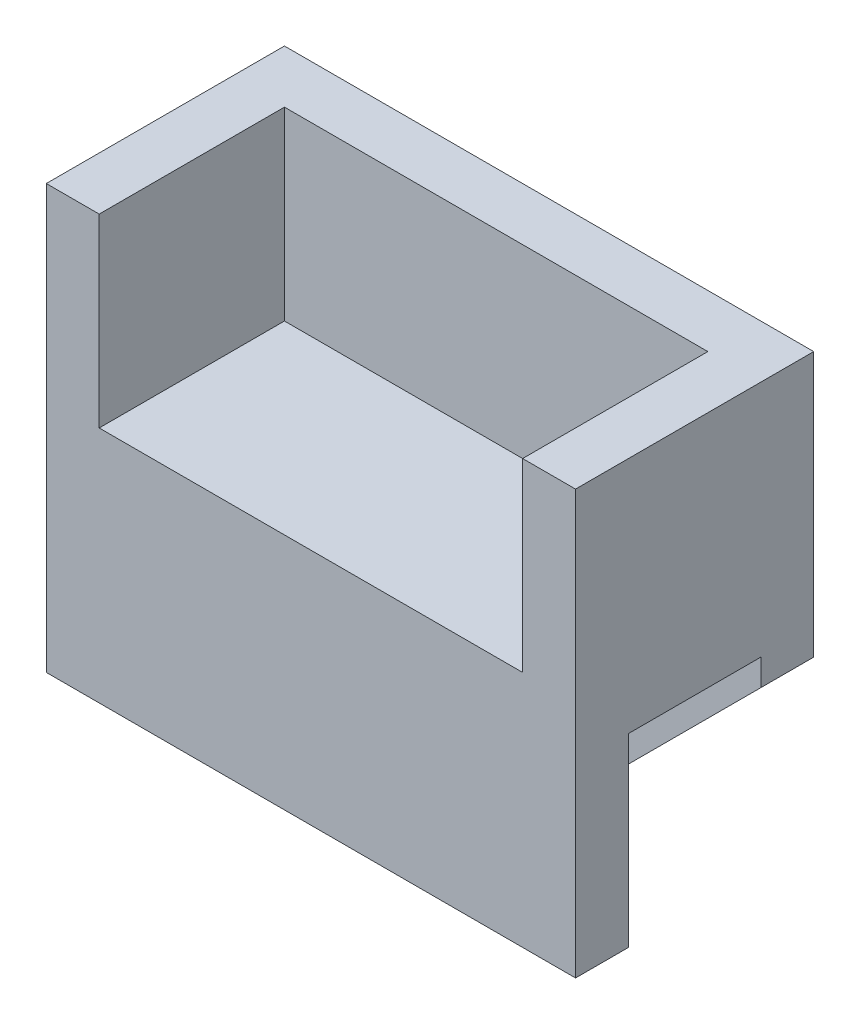
ISO-10303-21;
HEADER;
FILE_DESCRIPTION(('STEP AP214'),'2;1');
FILE_NAME('part.step','',(''),(''),'','','');
FILE_SCHEMA(('AUTOMOTIVE_DESIGN { 1 0 10303 214 1 1 1 1 }'));
ENDSEC;
DATA;
#1=APPLICATION_CONTEXT('core data for automotive mechanical design processes');
#2=APPLICATION_PROTOCOL_DEFINITION('international standard','automotive_design',2000,#1);
#3=PRODUCT_CONTEXT('',#1,'mechanical');
#4=PRODUCT('Part','Part','',(#3));
#5=PRODUCT_RELATED_PRODUCT_CATEGORY('part','',(#4));
#6=PRODUCT_DEFINITION_FORMATION('','',#4);
#7=PRODUCT_DEFINITION_CONTEXT('part definition',#1,'design');
#8=PRODUCT_DEFINITION('design','',#6,#7);
#9=PRODUCT_DEFINITION_SHAPE('','',#8);
#10=(LENGTH_UNIT() NAMED_UNIT(*) SI_UNIT(.MILLI.,.METRE.));
#11=(NAMED_UNIT(*) PLANE_ANGLE_UNIT() SI_UNIT($,.RADIAN.));
#12=(NAMED_UNIT(*) SI_UNIT($,.STERADIAN.) SOLID_ANGLE_UNIT());
#13=UNCERTAINTY_MEASURE_WITH_UNIT(LENGTH_MEASURE(1.E-05),#10,'distance_accuracy_value','');
#14=(GEOMETRIC_REPRESENTATION_CONTEXT(3) GLOBAL_UNCERTAINTY_ASSIGNED_CONTEXT((#13)) GLOBAL_UNIT_ASSIGNED_CONTEXT((#10,
#11,#12)) REPRESENTATION_CONTEXT('',''));
#15=CARTESIAN_POINT('',(0.,0.,0.));
#16=DIRECTION('',(0.,0.,1.));
#17=DIRECTION('',(1.,0.,0.));
#18=AXIS2_PLACEMENT_3D('',#15,#16,#17);
#19=CARTESIAN_POINT('',(-50.,55.,45.));
#20=DIRECTION('',(0.,1.,0.));
#21=DIRECTION('',(0.,0.,1.));
#22=AXIS2_PLACEMENT_3D('',#19,#20,#21);
#23=PLANE('',#22);
#24=DIRECTION('',(0.,0.,1.));
#25=VECTOR('',#24,1.);
#26=CARTESIAN_POINT('',(-46.1602540378444,55.,10.));
#27=LINE('',#26,#25);
#28=CARTESIAN_POINT('',(-46.1602540378444,55.,35.));
#29=VERTEX_POINT('',#28);
#30=CARTESIAN_POINT('',(-46.1602540378444,55.,10.));
#31=VERTEX_POINT('',#30);
#32=EDGE_CURVE('E196',#29,#31,#27,.F.);
#33=ORIENTED_EDGE('',*,*,#32,.F.);
#34=DIRECTION('',(1.,0.,0.));
#35=VECTOR('',#34,1.);
#36=CARTESIAN_POINT('',(-50.,55.,35.));
#37=LINE('',#36,#35);
#38=CARTESIAN_POINT('',(-50.,55.,35.));
#39=VERTEX_POINT('',#38);
#40=EDGE_CURVE('E216',#39,#29,#37,.T.);
#41=ORIENTED_EDGE('',*,*,#40,.F.);
#42=DIRECTION('',(0.,0.,-1.));
#43=VECTOR('',#42,1.);
#44=CARTESIAN_POINT('',(-50.,55.,45.));
#45=LINE('',#44,#43);
#46=CARTESIAN_POINT('',(-50.,55.,10.));
#47=VERTEX_POINT('',#46);
#48=EDGE_CURVE('E245',#39,#47,#45,.T.);
#49=ORIENTED_EDGE('',*,*,#48,.T.);
#50=DIRECTION('',(1.,0.,0.));
#51=VECTOR('',#50,1.);
#52=CARTESIAN_POINT('',(-50.,55.,10.));
#53=LINE('',#52,#51);
#54=EDGE_CURVE('E235',#47,#31,#53,.T.);
#55=ORIENTED_EDGE('',*,*,#54,.T.);
#56=EDGE_LOOP('',(#33,#41,#49,#55));
#57=FACE_BOUND('',#56,.T.);
#58=ADVANCED_FACE('F41',(#57),#23,.F.);
#59=DIRECTION('',(0.,0.,1.));
#60=VECTOR('',#59,1.);
#61=CARTESIAN_POINT('',(-28.8397459621556,55.,10.));
#62=LINE('',#61,#60);
#63=CARTESIAN_POINT('',(-28.8397459621556,55.,10.));
#64=VERTEX_POINT('',#63);
#65=CARTESIAN_POINT('',(-28.8397459621556,55.,35.));
#66=VERTEX_POINT('',#65);
#67=EDGE_CURVE('E64',#64,#66,#62,.T.);
#68=ORIENTED_EDGE('',*,*,#67,.F.);
#69=CARTESIAN_POINT('',(28.8397459621556,55.,10.));
#70=VERTEX_POINT('',#69);
#71=EDGE_CURVE('E242',#64,#70,#53,.T.);
#72=ORIENTED_EDGE('',*,*,#71,.T.);
#73=DIRECTION('',(0.,0.,1.));
#74=VECTOR('',#73,1.);
#75=CARTESIAN_POINT('',(28.8397459621556,55.,10.));
#76=LINE('',#75,#74);
#77=CARTESIAN_POINT('',(28.8397459621556,55.,35.));
#78=VERTEX_POINT('',#77);
#79=EDGE_CURVE('E208',#78,#70,#76,.F.);
#80=ORIENTED_EDGE('',*,*,#79,.F.);
#81=EDGE_CURVE('E226',#66,#78,#37,.T.);
#82=ORIENTED_EDGE('',*,*,#81,.F.);
#83=EDGE_LOOP('',(#68,#72,#80,#82));
#84=FACE_BOUND('',#83,.T.);
#85=ADVANCED_FACE('F340',(#84),#23,.F.);
#86=DIRECTION('',(0.,0.,1.));
#87=VECTOR('',#86,1.);
#88=CARTESIAN_POINT('',(46.1602540378444,55.,10.));
#89=LINE('',#88,#87);
#90=CARTESIAN_POINT('',(46.1602540378444,55.,10.));
#91=VERTEX_POINT('',#90);
#92=CARTESIAN_POINT('',(46.1602540378444,55.,35.));
#93=VERTEX_POINT('',#92);
#94=EDGE_CURVE('E203',#91,#93,#89,.T.);
#95=ORIENTED_EDGE('',*,*,#94,.F.);
#96=CARTESIAN_POINT('',(50.,55.,10.));
#97=VERTEX_POINT('',#96);
#98=EDGE_CURVE('E231',#91,#97,#53,.T.);
#99=ORIENTED_EDGE('',*,*,#98,.T.);
#100=DIRECTION('',(0.,0.,-1.));
#101=VECTOR('',#100,1.);
#102=CARTESIAN_POINT('',(50.,55.,45.));
#103=LINE('',#102,#101);
#104=CARTESIAN_POINT('',(50.,55.,35.));
#105=VERTEX_POINT('',#104);
#106=EDGE_CURVE('E239',#105,#97,#103,.T.);
#107=ORIENTED_EDGE('',*,*,#106,.F.);
#108=EDGE_CURVE('E211',#93,#105,#37,.T.);
#109=ORIENTED_EDGE('',*,*,#108,.F.);
#110=EDGE_LOOP('',(#95,#99,#107,#109));
#111=FACE_BOUND('',#110,.T.);
#112=ADVANCED_FACE('F342',(#111),#23,.F.);
#113=CARTESIAN_POINT('',(0.,0.,10.));
#114=DIRECTION('',(0.,0.,-1.));
#115=DIRECTION('',(-1.,0.,0.));
#116=AXIS2_PLACEMENT_3D('',#113,#114,#115);
#117=PLANE('',#116);
#118=CARTESIAN_POINT('',(-37.5,60.,10.));
#119=DIRECTION('',(0.,0.,-1.));
#120=DIRECTION('',(-1.,0.,0.));
#121=AXIS2_PLACEMENT_3D('',#118,#119,#120);
#122=CIRCLE('',#121,10.);
#123=EDGE_CURVE('E193',#64,#31,#122,.T.);
#124=ORIENTED_EDGE('',*,*,#123,.T.);
#125=ORIENTED_EDGE('',*,*,#54,.F.);
#126=DIRECTION('',(0.,-1.,0.));
#127=VECTOR('',#126,1.);
#128=CARTESIAN_POINT('',(-50.,49.9999999999998,10.));
#129=LINE('',#128,#127);
#130=CARTESIAN_POINT('',(-50.,49.9999999999998,10.));
#131=VERTEX_POINT('',#130);
#132=EDGE_CURVE('E255',#47,#131,#129,.T.);
#133=ORIENTED_EDGE('',*,*,#132,.T.);
#134=DIRECTION('',(0.707106781186549,-0.707106781186546,0.));
#135=VECTOR('',#134,1.);
#136=CARTESIAN_POINT('',(0.,0.,10.));
#137=LINE('',#136,#135);
#138=CARTESIAN_POINT('',(0.,0.,10.));
#139=VERTEX_POINT('',#138);
#140=EDGE_CURVE('E257',#131,#139,#137,.T.);
#141=ORIENTED_EDGE('',*,*,#140,.T.);
#142=DIRECTION('',(0.707106781186549,0.707106781186547,0.));
#143=VECTOR('',#142,1.);
#144=CARTESIAN_POINT('',(50.,49.9999999999999,10.));
#145=LINE('',#144,#143);
#146=CARTESIAN_POINT('',(50.,49.9999999999999,10.));
#147=VERTEX_POINT('',#146);
#148=EDGE_CURVE('E248',#139,#147,#145,.T.);
#149=ORIENTED_EDGE('',*,*,#148,.T.);
#150=DIRECTION('',(0.,1.,0.));
#151=VECTOR('',#150,1.);
#152=CARTESIAN_POINT('',(50.,100.,10.));
#153=LINE('',#152,#151);
#154=EDGE_CURVE('E251',#147,#97,#153,.T.);
#155=ORIENTED_EDGE('',*,*,#154,.T.);
#156=ORIENTED_EDGE('',*,*,#98,.F.);
#157=CARTESIAN_POINT('',(37.5,60.,10.));
#158=DIRECTION('',(0.,0.,-1.));
#159=DIRECTION('',(-1.,0.,0.));
#160=AXIS2_PLACEMENT_3D('',#157,#158,#159);
#161=CIRCLE('',#160,10.);
#162=EDGE_CURVE('E200',#91,#70,#161,.T.);
#163=ORIENTED_EDGE('',*,*,#162,.T.);
#164=ORIENTED_EDGE('',*,*,#71,.F.);
#165=EDGE_LOOP('',(#124,#125,#133,#141,#149,#155,#156,#163,#164));
#166=FACE_BOUND('',#165,.T.);
#167=ADVANCED_FACE('F299',(#166),#117,.F.);
#168=CARTESIAN_POINT('',(50.,49.9999999999999,10.));
#169=DIRECTION('',(-0.707106781186547,0.707106781186549,0.));
#170=DIRECTION('',(-0.707106781186549,-0.707106781186547,0.));
#171=AXIS2_PLACEMENT_3D('',#168,#169,#170);
#172=PLANE('',#171);
#173=DIRECTION('',(0.707106781186549,0.707106781186547,0.));
#174=VECTOR('',#173,1.);
#175=CARTESIAN_POINT('',(50.,49.9999999999999,0.));
#176=LINE('',#175,#174);
#177=CARTESIAN_POINT('',(0.,0.,0.));
#178=VERTEX_POINT('',#177);
#179=CARTESIAN_POINT('',(50.,49.9999999999999,0.));
#180=VERTEX_POINT('',#179);
#181=EDGE_CURVE('E247',#178,#180,#176,.T.);
#182=ORIENTED_EDGE('',*,*,#181,.T.);
#183=DIRECTION('',(0.,0.,-1.));
#184=VECTOR('',#183,1.);
#185=CARTESIAN_POINT('',(50.,49.9999999999999,10.));
#186=LINE('',#185,#184);
#187=EDGE_CURVE('E11',#147,#180,#186,.T.);
#188=ORIENTED_EDGE('',*,*,#187,.F.);
#189=ORIENTED_EDGE('',*,*,#148,.F.);
#190=DIRECTION('',(0.,0.,-1.));
#191=VECTOR('',#190,1.);
#192=CARTESIAN_POINT('',(0.,0.,10.));
#193=LINE('',#192,#191);
#194=EDGE_CURVE('E259',#139,#178,#193,.T.);
#195=ORIENTED_EDGE('',*,*,#194,.T.);
#196=EDGE_LOOP('',(#182,#188,#189,#195));
#197=FACE_BOUND('',#196,.T.);
#198=ADVANCED_FACE('F43',(#197),#172,.F.);
#199=CARTESIAN_POINT('',(50.,100.,10.));
#200=DIRECTION('',(-1.,0.,0.));
#201=DIRECTION('',(0.,0.,1.));
#202=AXIS2_PLACEMENT_3D('',#199,#200,#201);
#203=PLANE('',#202);
#204=DIRECTION('',(0.,1.,0.));
#205=VECTOR('',#204,1.);
#206=CARTESIAN_POINT('',(50.,100.,0.));
#207=LINE('',#206,#205);
#208=CARTESIAN_POINT('',(50.,100.,0.));
#209=VERTEX_POINT('',#208);
#210=EDGE_CURVE('E262',#180,#209,#207,.T.);
#211=ORIENTED_EDGE('',*,*,#210,.T.);
#212=DIRECTION('',(0.,0.,-1.));
#213=VECTOR('',#212,1.);
#214=CARTESIAN_POINT('',(50.,100.,10.));
#215=LINE('',#214,#213);
#216=CARTESIAN_POINT('',(50.,100.,45.));
#217=VERTEX_POINT('',#216);
#218=EDGE_CURVE('E49',#217,#209,#215,.T.);
#219=ORIENTED_EDGE('',*,*,#218,.F.);
#220=DIRECTION('',(0.,1.,0.));
#221=VECTOR('',#220,1.);
#222=CARTESIAN_POINT('',(50.,100.,45.));
#223=LINE('',#222,#221);
#224=CARTESIAN_POINT('',(50.,20.,45.));
#225=VERTEX_POINT('',#224);
#226=EDGE_CURVE('E234',#225,#217,#223,.T.);
#227=ORIENTED_EDGE('',*,*,#226,.F.);
#228=DIRECTION('',(0.,0.,1.));
#229=VECTOR('',#228,1.);
#230=CARTESIAN_POINT('',(50.,20.,45.));
#231=LINE('',#230,#229);
#232=CARTESIAN_POINT('',(50.,20.,35.));
#233=VERTEX_POINT('',#232);
#234=EDGE_CURVE('E218',#233,#225,#231,.T.);
#235=ORIENTED_EDGE('',*,*,#234,.F.);
#236=DIRECTION('',(0.,1.,0.));
#237=VECTOR('',#236,1.);
#238=CARTESIAN_POINT('',(50.,20.,35.));
#239=LINE('',#238,#237);
#240=EDGE_CURVE('E224',#233,#105,#239,.T.);
#241=ORIENTED_EDGE('',*,*,#240,.T.);
#242=ORIENTED_EDGE('',*,*,#106,.T.);
#243=ORIENTED_EDGE('',*,*,#154,.F.);
#244=ORIENTED_EDGE('',*,*,#187,.T.);
#245=EDGE_LOOP('',(#211,#219,#227,#235,#241,#242,#243,#244));
#246=FACE_BOUND('',#245,.T.);
#247=ADVANCED_FACE('F385',(#246),#203,.F.);
#248=CARTESIAN_POINT('',(-50.,100.,10.));
#249=DIRECTION('',(0.,-1.,0.));
#250=DIRECTION('',(0.,0.,-1.));
#251=AXIS2_PLACEMENT_3D('',#248,#249,#250);
#252=PLANE('',#251);
#253=DIRECTION('',(-1.,0.,0.));
#254=VECTOR('',#253,1.);
#255=CARTESIAN_POINT('',(-50.,100.,45.));
#256=LINE('',#255,#254);
#257=CARTESIAN_POINT('',(-40.,100.,45.));
#258=VERTEX_POINT('',#257);
#259=CARTESIAN_POINT('',(-50.,100.,45.));
#260=VERTEX_POINT('',#259);
#261=EDGE_CURVE('E237',#258,#260,#256,.T.);
#262=ORIENTED_EDGE('',*,*,#261,.F.);
#263=DIRECTION('',(0.,0.,1.));
#264=VECTOR('',#263,1.);
#265=CARTESIAN_POINT('',(-40.,100.,45.));
#266=LINE('',#265,#264);
#267=CARTESIAN_POINT('',(-40.,100.,10.));
#268=VERTEX_POINT('',#267);
#269=EDGE_CURVE('E317',#268,#258,#266,.T.);
#270=ORIENTED_EDGE('',*,*,#269,.F.);
#271=DIRECTION('',(-1.,0.,0.));
#272=VECTOR('',#271,1.);
#273=CARTESIAN_POINT('',(-40.,100.,10.));
#274=LINE('',#273,#272);
#275=CARTESIAN_POINT('',(40.,100.,10.));
#276=VERTEX_POINT('',#275);
#277=EDGE_CURVE('E319',#276,#268,#274,.T.);
#278=ORIENTED_EDGE('',*,*,#277,.F.);
#279=DIRECTION('',(0.,0.,-1.));
#280=VECTOR('',#279,1.);
#281=CARTESIAN_POINT('',(40.,100.,45.));
#282=LINE('',#281,#280);
#283=CARTESIAN_POINT('',(40.,100.,45.));
#284=VERTEX_POINT('',#283);
#285=EDGE_CURVE('E321',#284,#276,#282,.T.);
#286=ORIENTED_EDGE('',*,*,#285,.F.);
#287=EDGE_CURVE('E182',#217,#284,#256,.T.);
#288=ORIENTED_EDGE('',*,*,#287,.F.);
#289=ORIENTED_EDGE('',*,*,#218,.T.);
#290=DIRECTION('',(-1.,0.,0.));
#291=VECTOR('',#290,1.);
#292=CARTESIAN_POINT('',(-50.,100.,0.));
#293=LINE('',#292,#291);
#294=CARTESIAN_POINT('',(-50.,100.,0.));
#295=VERTEX_POINT('',#294);
#296=EDGE_CURVE('E264',#209,#295,#293,.T.);
#297=ORIENTED_EDGE('',*,*,#296,.T.);
#298=DIRECTION('',(0.,0.,-1.));
#299=VECTOR('',#298,1.);
#300=CARTESIAN_POINT('',(-50.,100.,10.));
#301=LINE('',#300,#299);
#302=EDGE_CURVE('E274',#260,#295,#301,.T.);
#303=ORIENTED_EDGE('',*,*,#302,.F.);
#304=EDGE_LOOP('',(#262,#270,#278,#286,#288,#289,#297,#303));
#305=FACE_BOUND('',#304,.T.);
#306=ADVANCED_FACE('F280',(#305),#252,.F.);
#307=CARTESIAN_POINT('',(-50.,49.9999999999998,10.));
#308=DIRECTION('',(1.,0.,0.));
#309=DIRECTION('',(0.,0.,-1.));
#310=AXIS2_PLACEMENT_3D('',#307,#308,#309);
#311=PLANE('',#310);
#312=DIRECTION('',(0.,-1.,0.));
#313=VECTOR('',#312,1.);
#314=CARTESIAN_POINT('',(-50.,49.9999999999998,0.));
#315=LINE('',#314,#313);
#316=CARTESIAN_POINT('',(-50.,49.9999999999998,0.));
#317=VERTEX_POINT('',#316);
#318=EDGE_CURVE('E266',#295,#317,#315,.T.);
#319=ORIENTED_EDGE('',*,*,#318,.T.);
#320=DIRECTION('',(0.,0.,-1.));
#321=VECTOR('',#320,1.);
#322=CARTESIAN_POINT('',(-50.,49.9999999999998,10.));
#323=LINE('',#322,#321);
#324=EDGE_CURVE('E271',#131,#317,#323,.T.);
#325=ORIENTED_EDGE('',*,*,#324,.F.);
#326=ORIENTED_EDGE('',*,*,#132,.F.);
#327=ORIENTED_EDGE('',*,*,#48,.F.);
#328=DIRECTION('',(0.,1.,0.));
#329=VECTOR('',#328,1.);
#330=CARTESIAN_POINT('',(-50.,20.,35.));
#331=LINE('',#330,#329);
#332=CARTESIAN_POINT('',(-50.,20.,35.));
#333=VERTEX_POINT('',#332);
#334=EDGE_CURVE('E229',#333,#39,#331,.T.);
#335=ORIENTED_EDGE('',*,*,#334,.F.);
#336=DIRECTION('',(0.,0.,-1.));
#337=VECTOR('',#336,1.);
#338=CARTESIAN_POINT('',(-50.,20.,45.));
#339=LINE('',#338,#337);
#340=CARTESIAN_POINT('',(-50.,20.,45.));
#341=VERTEX_POINT('',#340);
#342=EDGE_CURVE('E212',#341,#333,#339,.T.);
#343=ORIENTED_EDGE('',*,*,#342,.F.);
#344=DIRECTION('',(0.,-1.,0.));
#345=VECTOR('',#344,1.);
#346=CARTESIAN_POINT('',(-50.,100.,45.));
#347=LINE('',#346,#345);
#348=EDGE_CURVE('E232',#260,#341,#347,.T.);
#349=ORIENTED_EDGE('',*,*,#348,.F.);
#350=ORIENTED_EDGE('',*,*,#302,.T.);
#351=EDGE_LOOP('',(#319,#325,#326,#327,#335,#343,#349,#350));
#352=FACE_BOUND('',#351,.T.);
#353=ADVANCED_FACE('F290',(#352),#311,.F.);
#354=CARTESIAN_POINT('',(0.,0.,10.));
#355=DIRECTION('',(0.707106781186546,0.707106781186549,0.));
#356=DIRECTION('',(-0.707106781186549,0.707106781186546,0.));
#357=AXIS2_PLACEMENT_3D('',#354,#355,#356);
#358=PLANE('',#357);
#359=DIRECTION('',(0.707106781186549,-0.707106781186546,0.));
#360=VECTOR('',#359,1.);
#361=CARTESIAN_POINT('',(0.,0.,0.));
#362=LINE('',#361,#360);
#363=EDGE_CURVE('E252',#317,#178,#362,.T.);
#364=ORIENTED_EDGE('',*,*,#363,.T.);
#365=ORIENTED_EDGE('',*,*,#194,.F.);
#366=ORIENTED_EDGE('',*,*,#140,.F.);
#367=ORIENTED_EDGE('',*,*,#324,.T.);
#368=EDGE_LOOP('',(#364,#365,#366,#367));
#369=FACE_BOUND('',#368,.T.);
#370=ADVANCED_FACE('F295',(#369),#358,.F.);
#371=CARTESIAN_POINT('',(0.,0.,0.));
#372=DIRECTION('',(0.,0.,-1.));
#373=DIRECTION('',(-1.,0.,0.));
#374=AXIS2_PLACEMENT_3D('',#371,#372,#373);
#375=PLANE('',#374);
#376=ORIENTED_EDGE('',*,*,#181,.F.);
#377=ORIENTED_EDGE('',*,*,#363,.F.);
#378=ORIENTED_EDGE('',*,*,#318,.F.);
#379=ORIENTED_EDGE('',*,*,#296,.F.);
#380=ORIENTED_EDGE('',*,*,#210,.F.);
#381=EDGE_LOOP('',(#376,#377,#378,#379,#380));
#382=FACE_BOUND('',#381,.T.);
#383=ADVANCED_FACE('F286',(#382),#375,.T.);
#384=CARTESIAN_POINT('',(0.,0.,45.));
#385=DIRECTION('',(0.,0.,1.));
#386=DIRECTION('',(1.,0.,0.));
#387=AXIS2_PLACEMENT_3D('',#384,#385,#386);
#388=PLANE('',#387);
#389=DIRECTION('',(0.,1.,0.));
#390=VECTOR('',#389,1.);
#391=CARTESIAN_POINT('',(-40.,65.,45.));
#392=LINE('',#391,#390);
#393=CARTESIAN_POINT('',(-40.,65.,45.));
#394=VERTEX_POINT('',#393);
#395=EDGE_CURVE('E183',#394,#258,#392,.T.);
#396=ORIENTED_EDGE('',*,*,#395,.T.);
#397=ORIENTED_EDGE('',*,*,#261,.T.);
#398=ORIENTED_EDGE('',*,*,#348,.T.);
#399=DIRECTION('',(-1.,0.,0.));
#400=VECTOR('',#399,1.);
#401=CARTESIAN_POINT('',(-50.,20.,45.));
#402=LINE('',#401,#400);
#403=EDGE_CURVE('E221',#225,#341,#402,.T.);
#404=ORIENTED_EDGE('',*,*,#403,.F.);
#405=ORIENTED_EDGE('',*,*,#226,.T.);
#406=ORIENTED_EDGE('',*,*,#287,.T.);
#407=DIRECTION('',(0.,1.,0.));
#408=VECTOR('',#407,1.);
#409=CARTESIAN_POINT('',(40.,65.,45.));
#410=LINE('',#409,#408);
#411=CARTESIAN_POINT('',(40.,65.,45.));
#412=VERTEX_POINT('',#411);
#413=EDGE_CURVE('E166',#412,#284,#410,.T.);
#414=ORIENTED_EDGE('',*,*,#413,.F.);
#415=DIRECTION('',(1.,0.,0.));
#416=VECTOR('',#415,1.);
#417=CARTESIAN_POINT('',(-40.,65.,45.));
#418=LINE('',#417,#416);
#419=EDGE_CURVE('E171',#394,#412,#418,.T.);
#420=ORIENTED_EDGE('',*,*,#419,.F.);
#421=EDGE_LOOP('',(#396,#397,#398,#404,#405,#406,#414,#420));
#422=FACE_BOUND('',#421,.T.);
#423=ADVANCED_FACE('F179',(#422),#388,.T.);
#424=CARTESIAN_POINT('',(-50.,20.,35.));
#425=DIRECTION('',(0.,0.,1.));
#426=DIRECTION('',(1.,0.,0.));
#427=AXIS2_PLACEMENT_3D('',#424,#425,#426);
#428=PLANE('',#427);
#429=CARTESIAN_POINT('',(-37.5,60.,35.));
#430=DIRECTION('',(0.,0.,-1.));
#431=DIRECTION('',(-1.,0.,0.));
#432=AXIS2_PLACEMENT_3D('',#429,#430,#431);
#433=CIRCLE('',#432,10.);
#434=EDGE_CURVE('E190',#66,#29,#433,.T.);
#435=ORIENTED_EDGE('',*,*,#434,.F.);
#436=ORIENTED_EDGE('',*,*,#81,.T.);
#437=CARTESIAN_POINT('',(37.5,60.,35.));
#438=DIRECTION('',(0.,0.,-1.));
#439=DIRECTION('',(-1.,0.,0.));
#440=AXIS2_PLACEMENT_3D('',#437,#438,#439);
#441=CIRCLE('',#440,10.);
#442=EDGE_CURVE('E199',#93,#78,#441,.T.);
#443=ORIENTED_EDGE('',*,*,#442,.F.);
#444=ORIENTED_EDGE('',*,*,#108,.T.);
#445=ORIENTED_EDGE('',*,*,#240,.F.);
#446=DIRECTION('',(1.,0.,0.));
#447=VECTOR('',#446,1.);
#448=CARTESIAN_POINT('',(-50.,20.,35.));
#449=LINE('',#448,#447);
#450=EDGE_CURVE('E215',#333,#233,#449,.T.);
#451=ORIENTED_EDGE('',*,*,#450,.F.);
#452=ORIENTED_EDGE('',*,*,#334,.T.);
#453=ORIENTED_EDGE('',*,*,#40,.T.);
#454=EDGE_LOOP('',(#435,#436,#443,#444,#445,#451,#452,#453));
#455=FACE_BOUND('',#454,.T.);
#456=ADVANCED_FACE('F309',(#455),#428,.F.);
#457=CARTESIAN_POINT('',(0.,20.,0.));
#458=DIRECTION('',(0.,-1.,0.));
#459=DIRECTION('',(0.,0.,-1.));
#460=AXIS2_PLACEMENT_3D('',#457,#458,#459);
#461=PLANE('',#460);
#462=ORIENTED_EDGE('',*,*,#342,.T.);
#463=ORIENTED_EDGE('',*,*,#450,.T.);
#464=ORIENTED_EDGE('',*,*,#234,.T.);
#465=ORIENTED_EDGE('',*,*,#403,.T.);
#466=EDGE_LOOP('',(#462,#463,#464,#465));
#467=FACE_BOUND('',#466,.T.);
#468=ADVANCED_FACE('F313',(#467),#461,.T.);
#469=CARTESIAN_POINT('',(37.5,60.,10.));
#470=DIRECTION('',(0.,0.,1.));
#471=DIRECTION('',(1.,0.,0.));
#472=AXIS2_PLACEMENT_3D('',#469,#470,#471);
#473=CYLINDRICAL_SURFACE('',#472,10.);
#474=ORIENTED_EDGE('',*,*,#442,.T.);
#475=ORIENTED_EDGE('',*,*,#79,.T.);
#476=ORIENTED_EDGE('',*,*,#162,.F.);
#477=ORIENTED_EDGE('',*,*,#94,.T.);
#478=EDGE_LOOP('',(#474,#475,#476,#477));
#479=FACE_BOUND('',#478,.T.);
#480=ADVANCED_FACE('F358',(#479),#473,.T.);
#481=CARTESIAN_POINT('',(-37.5,60.,10.));
#482=DIRECTION('',(0.,0.,1.));
#483=DIRECTION('',(1.,0.,0.));
#484=AXIS2_PLACEMENT_3D('',#481,#482,#483);
#485=CYLINDRICAL_SURFACE('',#484,10.);
#486=ORIENTED_EDGE('',*,*,#434,.T.);
#487=ORIENTED_EDGE('',*,*,#32,.T.);
#488=ORIENTED_EDGE('',*,*,#123,.F.);
#489=ORIENTED_EDGE('',*,*,#67,.T.);
#490=EDGE_LOOP('',(#486,#487,#488,#489));
#491=FACE_BOUND('',#490,.T.);
#492=ADVANCED_FACE('F336',(#491),#485,.T.);
#493=CARTESIAN_POINT('',(-40.,65.,45.));
#494=DIRECTION('',(-1.,0.,0.));
#495=DIRECTION('',(0.,0.,1.));
#496=AXIS2_PLACEMENT_3D('',#493,#494,#495);
#497=PLANE('',#496);
#498=ORIENTED_EDGE('',*,*,#269,.T.);
#499=ORIENTED_EDGE('',*,*,#395,.F.);
#500=DIRECTION('',(0.,0.,1.));
#501=VECTOR('',#500,1.);
#502=CARTESIAN_POINT('',(-40.,65.,45.));
#503=LINE('',#502,#501);
#504=CARTESIAN_POINT('',(-40.,65.,10.));
#505=VERTEX_POINT('',#504);
#506=EDGE_CURVE('E56',#505,#394,#503,.T.);
#507=ORIENTED_EDGE('',*,*,#506,.F.);
#508=DIRECTION('',(0.,1.,0.));
#509=VECTOR('',#508,1.);
#510=CARTESIAN_POINT('',(-40.,65.,10.));
#511=LINE('',#510,#509);
#512=EDGE_CURVE('E185',#505,#268,#511,.T.);
#513=ORIENTED_EDGE('',*,*,#512,.T.);
#514=EDGE_LOOP('',(#498,#499,#507,#513));
#515=FACE_BOUND('',#514,.T.);
#516=ADVANCED_FACE('F326',(#515),#497,.F.);
#517=CARTESIAN_POINT('',(-40.,65.,10.));
#518=DIRECTION('',(0.,0.,-1.));
#519=DIRECTION('',(-1.,0.,0.));
#520=AXIS2_PLACEMENT_3D('',#517,#518,#519);
#521=PLANE('',#520);
#522=ORIENTED_EDGE('',*,*,#277,.T.);
#523=ORIENTED_EDGE('',*,*,#512,.F.);
#524=DIRECTION('',(-1.,0.,0.));
#525=VECTOR('',#524,1.);
#526=CARTESIAN_POINT('',(-40.,65.,10.));
#527=LINE('',#526,#525);
#528=CARTESIAN_POINT('',(40.,65.,10.));
#529=VERTEX_POINT('',#528);
#530=EDGE_CURVE('E170',#529,#505,#527,.T.);
#531=ORIENTED_EDGE('',*,*,#530,.F.);
#532=DIRECTION('',(0.,1.,0.));
#533=VECTOR('',#532,1.);
#534=CARTESIAN_POINT('',(40.,65.,10.));
#535=LINE('',#534,#533);
#536=EDGE_CURVE('E168',#529,#276,#535,.T.);
#537=ORIENTED_EDGE('',*,*,#536,.T.);
#538=EDGE_LOOP('',(#522,#523,#531,#537));
#539=FACE_BOUND('',#538,.T.);
#540=ADVANCED_FACE('F328',(#539),#521,.F.);
#541=CARTESIAN_POINT('',(40.,65.,45.));
#542=DIRECTION('',(1.,0.,0.));
#543=DIRECTION('',(0.,0.,-1.));
#544=AXIS2_PLACEMENT_3D('',#541,#542,#543);
#545=PLANE('',#544);
#546=ORIENTED_EDGE('',*,*,#285,.T.);
#547=ORIENTED_EDGE('',*,*,#536,.F.);
#548=DIRECTION('',(0.,0.,-1.));
#549=VECTOR('',#548,1.);
#550=CARTESIAN_POINT('',(40.,65.,45.));
#551=LINE('',#550,#549);
#552=EDGE_CURVE('E162',#412,#529,#551,.T.);
#553=ORIENTED_EDGE('',*,*,#552,.F.);
#554=ORIENTED_EDGE('',*,*,#413,.T.);
#555=EDGE_LOOP('',(#546,#547,#553,#554));
#556=FACE_BOUND('',#555,.T.);
#557=ADVANCED_FACE('F164',(#556),#545,.F.);
#558=CARTESIAN_POINT('',(0.,65.,0.));
#559=DIRECTION('',(0.,-1.,0.));
#560=DIRECTION('',(0.,0.,-1.));
#561=AXIS2_PLACEMENT_3D('',#558,#559,#560);
#562=PLANE('',#561);
#563=ORIENTED_EDGE('',*,*,#506,.T.);
#564=ORIENTED_EDGE('',*,*,#419,.T.);
#565=ORIENTED_EDGE('',*,*,#552,.T.);
#566=ORIENTED_EDGE('',*,*,#530,.T.);
#567=EDGE_LOOP('',(#563,#564,#565,#566));
#568=FACE_BOUND('',#567,.T.);
#569=ADVANCED_FACE('F174',(#568),#562,.F.);
#570=CLOSED_SHELL('',(#58,#85,#112,#167,#198,#247,#306,#353,#370,#383,#423,#456,#468,#480,#492,
#516,#540,#557,#569));
#571=MANIFOLD_SOLID_BREP('B2',#570);
#572=ADVANCED_BREP_SHAPE_REPRESENTATION('',(#18,#571),#14);
#573=SHAPE_DEFINITION_REPRESENTATION(#9,#572);
ENDSEC;
END-ISO-10303-21;
